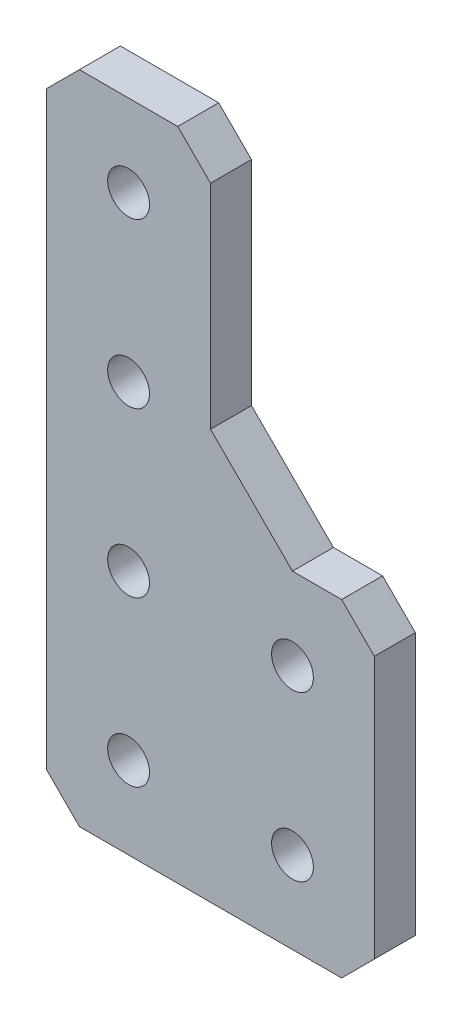
ISO-10303-21;
HEADER;
FILE_DESCRIPTION(('STEP AP214'),'2;1');
FILE_NAME('part.step','',(''),(''),'','','');
FILE_SCHEMA(('AUTOMOTIVE_DESIGN { 1 0 10303 214 1 1 1 1 }'));
ENDSEC;
DATA;
#1=APPLICATION_CONTEXT('core data for automotive mechanical design processes');
#2=APPLICATION_PROTOCOL_DEFINITION('international standard','automotive_design',2000,#1);
#3=PRODUCT_CONTEXT('',#1,'mechanical');
#4=PRODUCT('Part','Part','',(#3));
#5=PRODUCT_RELATED_PRODUCT_CATEGORY('part','',(#4));
#6=PRODUCT_DEFINITION_FORMATION('','',#4);
#7=PRODUCT_DEFINITION_CONTEXT('part definition',#1,'design');
#8=PRODUCT_DEFINITION('design','',#6,#7);
#9=PRODUCT_DEFINITION_SHAPE('','',#8);
#10=(LENGTH_UNIT() NAMED_UNIT(*) SI_UNIT(.MILLI.,.METRE.));
#11=(NAMED_UNIT(*) PLANE_ANGLE_UNIT() SI_UNIT($,.RADIAN.));
#12=(NAMED_UNIT(*) SI_UNIT($,.STERADIAN.) SOLID_ANGLE_UNIT());
#13=UNCERTAINTY_MEASURE_WITH_UNIT(LENGTH_MEASURE(1.E-05),#10,'distance_accuracy_value','');
#14=(GEOMETRIC_REPRESENTATION_CONTEXT(3) GLOBAL_UNCERTAINTY_ASSIGNED_CONTEXT((#13)) GLOBAL_UNIT_ASSIGNED_CONTEXT((#10,
#11,#12)) REPRESENTATION_CONTEXT('',''));
#15=CARTESIAN_POINT('',(0.,0.,0.));
#16=DIRECTION('',(0.,0.,1.));
#17=DIRECTION('',(1.,0.,0.));
#18=AXIS2_PLACEMENT_3D('',#15,#16,#17);
#19=CARTESIAN_POINT('',(40.,0.,5.));
#20=DIRECTION('',(0.,1.,0.));
#21=DIRECTION('',(-1.,0.,0.));
#22=AXIS2_PLACEMENT_3D('',#19,#20,#21);
#23=PLANE('',#22);
#24=DIRECTION('',(1.,0.,0.));
#25=VECTOR('',#24,1.);
#26=CARTESIAN_POINT('',(40.,0.,5.));
#27=LINE('',#26,#25);
#28=CARTESIAN_POINT('',(4.,0.,5.));
#29=VERTEX_POINT('',#28);
#30=CARTESIAN_POINT('',(36.,0.,5.));
#31=VERTEX_POINT('',#30);
#32=EDGE_CURVE('E176',#29,#31,#27,.T.);
#33=ORIENTED_EDGE('',*,*,#32,.F.);
#34=DIRECTION('',(0.,0.,-1.));
#35=VECTOR('',#34,1.);
#36=CARTESIAN_POINT('',(4.,0.,5.));
#37=LINE('',#36,#35);
#38=CARTESIAN_POINT('',(4.,0.,0.));
#39=VERTEX_POINT('',#38);
#40=EDGE_CURVE('E231',#29,#39,#37,.T.);
#41=ORIENTED_EDGE('',*,*,#40,.T.);
#42=DIRECTION('',(1.,0.,0.));
#43=VECTOR('',#42,1.);
#44=CARTESIAN_POINT('',(40.,0.,0.));
#45=LINE('',#44,#43);
#46=CARTESIAN_POINT('',(36.,0.,0.));
#47=VERTEX_POINT('',#46);
#48=EDGE_CURVE('E195',#39,#47,#45,.T.);
#49=ORIENTED_EDGE('',*,*,#48,.T.);
#50=DIRECTION('',(0.,0.,1.));
#51=VECTOR('',#50,1.);
#52=CARTESIAN_POINT('',(36.,0.,5.));
#53=LINE('',#52,#51);
#54=EDGE_CURVE('E229',#47,#31,#53,.T.);
#55=ORIENTED_EDGE('',*,*,#54,.T.);
#56=EDGE_LOOP('',(#33,#41,#49,#55));
#57=FACE_BOUND('',#56,.T.);
#58=ADVANCED_FACE('F45',(#57),#23,.F.);
#59=CARTESIAN_POINT('',(40.,0.,5.));
#60=DIRECTION('',(-1.,0.,0.));
#61=DIRECTION('',(0.,0.,1.));
#62=AXIS2_PLACEMENT_3D('',#59,#60,#61);
#63=PLANE('',#62);
#64=DIRECTION('',(0.,1.,0.));
#65=VECTOR('',#64,1.);
#66=CARTESIAN_POINT('',(40.,0.,5.));
#67=LINE('',#66,#65);
#68=CARTESIAN_POINT('',(40.,4.,5.));
#69=VERTEX_POINT('',#68);
#70=CARTESIAN_POINT('',(40.,36.,5.));
#71=VERTEX_POINT('',#70);
#72=EDGE_CURVE('E238',#69,#71,#67,.T.);
#73=ORIENTED_EDGE('',*,*,#72,.F.);
#74=DIRECTION('',(0.,0.,-1.));
#75=VECTOR('',#74,1.);
#76=CARTESIAN_POINT('',(40.,4.,5.));
#77=LINE('',#76,#75);
#78=CARTESIAN_POINT('',(40.,4.,0.));
#79=VERTEX_POINT('',#78);
#80=EDGE_CURVE('E54',#69,#79,#77,.T.);
#81=ORIENTED_EDGE('',*,*,#80,.T.);
#82=DIRECTION('',(0.,1.,0.));
#83=VECTOR('',#82,1.);
#84=CARTESIAN_POINT('',(40.,0.,0.));
#85=LINE('',#84,#83);
#86=CARTESIAN_POINT('',(40.,36.,0.));
#87=VERTEX_POINT('',#86);
#88=EDGE_CURVE('E170',#79,#87,#85,.T.);
#89=ORIENTED_EDGE('',*,*,#88,.T.);
#90=DIRECTION('',(0.,0.,1.));
#91=VECTOR('',#90,1.);
#92=CARTESIAN_POINT('',(40.,36.,5.));
#93=LINE('',#92,#91);
#94=EDGE_CURVE('E69',#87,#71,#93,.T.);
#95=ORIENTED_EDGE('',*,*,#94,.T.);
#96=EDGE_LOOP('',(#73,#81,#89,#95));
#97=FACE_BOUND('',#96,.T.);
#98=ADVANCED_FACE('F237',(#97),#63,.F.);
#99=CARTESIAN_POINT('',(40.,40.,5.));
#100=DIRECTION('',(0.,-1.,0.));
#101=DIRECTION('',(1.,0.,0.));
#102=AXIS2_PLACEMENT_3D('',#99,#100,#101);
#103=PLANE('',#102);
#104=DIRECTION('',(-1.,0.,0.));
#105=VECTOR('',#104,1.);
#106=CARTESIAN_POINT('',(40.,40.,5.));
#107=LINE('',#106,#105);
#108=CARTESIAN_POINT('',(36.,40.,5.));
#109=VERTEX_POINT('',#108);
#110=CARTESIAN_POINT('',(30.,40.,5.));
#111=VERTEX_POINT('',#110);
#112=EDGE_CURVE('E251',#109,#111,#107,.T.);
#113=ORIENTED_EDGE('',*,*,#112,.F.);
#114=DIRECTION('',(0.,0.,-1.));
#115=VECTOR('',#114,1.);
#116=CARTESIAN_POINT('',(36.,40.,5.));
#117=LINE('',#116,#115);
#118=CARTESIAN_POINT('',(36.,40.,0.));
#119=VERTEX_POINT('',#118);
#120=EDGE_CURVE('E11',#109,#119,#117,.T.);
#121=ORIENTED_EDGE('',*,*,#120,.T.);
#122=DIRECTION('',(-1.,0.,0.));
#123=VECTOR('',#122,1.);
#124=CARTESIAN_POINT('',(40.,40.,0.));
#125=LINE('',#124,#123);
#126=CARTESIAN_POINT('',(30.,40.,0.));
#127=VERTEX_POINT('',#126);
#128=EDGE_CURVE('E165',#119,#127,#125,.T.);
#129=ORIENTED_EDGE('',*,*,#128,.T.);
#130=DIRECTION('',(0.,0.,1.));
#131=VECTOR('',#130,1.);
#132=CARTESIAN_POINT('',(30.,40.,5.));
#133=LINE('',#132,#131);
#134=EDGE_CURVE('E144',#127,#111,#133,.T.);
#135=ORIENTED_EDGE('',*,*,#134,.T.);
#136=EDGE_LOOP('',(#113,#121,#129,#135));
#137=FACE_BOUND('',#136,.T.);
#138=ADVANCED_FACE('F323',(#137),#103,.F.);
#139=CARTESIAN_POINT('',(20.,80.,5.));
#140=DIRECTION('',(-1.,0.,0.));
#141=DIRECTION('',(0.,0.,1.));
#142=AXIS2_PLACEMENT_3D('',#139,#140,#141);
#143=PLANE('',#142);
#144=DIRECTION('',(0.,1.,0.));
#145=VECTOR('',#144,1.);
#146=CARTESIAN_POINT('',(20.,80.,0.));
#147=LINE('',#146,#145);
#148=CARTESIAN_POINT('',(20.,50.0000000000001,0.));
#149=VERTEX_POINT('',#148);
#150=CARTESIAN_POINT('',(20.,76.,0.));
#151=VERTEX_POINT('',#150);
#152=EDGE_CURVE('E154',#149,#151,#147,.T.);
#153=ORIENTED_EDGE('',*,*,#152,.T.);
#154=DIRECTION('',(0.,0.,1.));
#155=VECTOR('',#154,1.);
#156=CARTESIAN_POINT('',(20.,76.,5.));
#157=LINE('',#156,#155);
#158=CARTESIAN_POINT('',(20.,76.,5.));
#159=VERTEX_POINT('',#158);
#160=EDGE_CURVE('E203',#151,#159,#157,.T.);
#161=ORIENTED_EDGE('',*,*,#160,.T.);
#162=DIRECTION('',(0.,1.,0.));
#163=VECTOR('',#162,1.);
#164=CARTESIAN_POINT('',(20.,80.,5.));
#165=LINE('',#164,#163);
#166=CARTESIAN_POINT('',(20.,50.0000000000001,5.));
#167=VERTEX_POINT('',#166);
#168=EDGE_CURVE('E157',#167,#159,#165,.T.);
#169=ORIENTED_EDGE('',*,*,#168,.F.);
#170=DIRECTION('',(0.,0.,-1.));
#171=VECTOR('',#170,1.);
#172=CARTESIAN_POINT('',(20.,50.0000000000001,0.));
#173=LINE('',#172,#171);
#174=EDGE_CURVE('E142',#167,#149,#173,.T.);
#175=ORIENTED_EDGE('',*,*,#174,.T.);
#176=EDGE_LOOP('',(#153,#161,#169,#175));
#177=FACE_BOUND('',#176,.T.);
#178=ADVANCED_FACE('F153',(#177),#143,.F.);
#179=CARTESIAN_POINT('',(0.,80.,5.));
#180=DIRECTION('',(0.,-1.,0.));
#181=DIRECTION('',(0.,0.,-1.));
#182=AXIS2_PLACEMENT_3D('',#179,#180,#181);
#183=PLANE('',#182);
#184=DIRECTION('',(-1.,0.,0.));
#185=VECTOR('',#184,1.);
#186=CARTESIAN_POINT('',(0.,80.,0.));
#187=LINE('',#186,#185);
#188=CARTESIAN_POINT('',(16.,80.,0.));
#189=VERTEX_POINT('',#188);
#190=CARTESIAN_POINT('',(4.,80.,0.));
#191=VERTEX_POINT('',#190);
#192=EDGE_CURVE('E164',#189,#191,#187,.T.);
#193=ORIENTED_EDGE('',*,*,#192,.T.);
#194=DIRECTION('',(0.,0.,1.));
#195=VECTOR('',#194,1.);
#196=CARTESIAN_POINT('',(4.,80.,5.));
#197=LINE('',#196,#195);
#198=CARTESIAN_POINT('',(4.,80.,5.));
#199=VERTEX_POINT('',#198);
#200=EDGE_CURVE('E220',#191,#199,#197,.T.);
#201=ORIENTED_EDGE('',*,*,#200,.T.);
#202=DIRECTION('',(-1.,0.,0.));
#203=VECTOR('',#202,1.);
#204=CARTESIAN_POINT('',(0.,80.,5.));
#205=LINE('',#204,#203);
#206=CARTESIAN_POINT('',(16.,80.,5.));
#207=VERTEX_POINT('',#206);
#208=EDGE_CURVE('E247',#207,#199,#205,.T.);
#209=ORIENTED_EDGE('',*,*,#208,.F.);
#210=DIRECTION('',(0.,0.,-1.));
#211=VECTOR('',#210,1.);
#212=CARTESIAN_POINT('',(16.,80.,5.));
#213=LINE('',#212,#211);
#214=EDGE_CURVE('E199',#207,#189,#213,.T.);
#215=ORIENTED_EDGE('',*,*,#214,.T.);
#216=EDGE_LOOP('',(#193,#201,#209,#215));
#217=FACE_BOUND('',#216,.T.);
#218=ADVANCED_FACE('F464',(#217),#183,.F.);
#219=CARTESIAN_POINT('',(0.,0.,5.));
#220=DIRECTION('',(1.,0.,0.));
#221=DIRECTION('',(0.,0.,-1.));
#222=AXIS2_PLACEMENT_3D('',#219,#220,#221);
#223=PLANE('',#222);
#224=DIRECTION('',(0.,-1.,0.));
#225=VECTOR('',#224,1.);
#226=CARTESIAN_POINT('',(0.,0.,5.));
#227=LINE('',#226,#225);
#228=CARTESIAN_POINT('',(0.,76.,5.));
#229=VERTEX_POINT('',#228);
#230=CARTESIAN_POINT('',(0.,4.00000000000002,5.));
#231=VERTEX_POINT('',#230);
#232=EDGE_CURVE('E158',#229,#231,#227,.T.);
#233=ORIENTED_EDGE('',*,*,#232,.F.);
#234=DIRECTION('',(0.,0.,-1.));
#235=VECTOR('',#234,1.);
#236=CARTESIAN_POINT('',(0.,76.,5.));
#237=LINE('',#236,#235);
#238=CARTESIAN_POINT('',(0.,76.,0.));
#239=VERTEX_POINT('',#238);
#240=EDGE_CURVE('E209',#229,#239,#237,.T.);
#241=ORIENTED_EDGE('',*,*,#240,.T.);
#242=DIRECTION('',(0.,-1.,0.));
#243=VECTOR('',#242,1.);
#244=CARTESIAN_POINT('',(0.,0.,0.));
#245=LINE('',#244,#243);
#246=CARTESIAN_POINT('',(0.,4.00000000000002,0.));
#247=VERTEX_POINT('',#246);
#248=EDGE_CURVE('E168',#239,#247,#245,.T.);
#249=ORIENTED_EDGE('',*,*,#248,.T.);
#250=DIRECTION('',(0.,0.,1.));
#251=VECTOR('',#250,1.);
#252=CARTESIAN_POINT('',(0.,4.00000000000002,5.));
#253=LINE('',#252,#251);
#254=EDGE_CURVE('E207',#247,#231,#253,.T.);
#255=ORIENTED_EDGE('',*,*,#254,.T.);
#256=EDGE_LOOP('',(#233,#241,#249,#255));
#257=FACE_BOUND('',#256,.T.);
#258=ADVANCED_FACE('F279',(#257),#223,.F.);
#259=CARTESIAN_POINT('',(0.,0.,5.));
#260=DIRECTION('',(0.,0.,-1.));
#261=DIRECTION('',(-1.,0.,0.));
#262=AXIS2_PLACEMENT_3D('',#259,#260,#261);
#263=PLANE('',#262);
#264=CARTESIAN_POINT('',(10.,70.,5.));
#265=DIRECTION('',(0.,0.,1.));
#266=DIRECTION('',(1.,0.,0.));
#267=AXIS2_PLACEMENT_3D('',#264,#265,#266);
#268=CIRCLE('',#267,2.55);
#269=CARTESIAN_POINT('',(12.55,70.,5.));
#270=VERTEX_POINT('',#269);
#271=EDGE_CURVE('E181',#270,#270,#268,.T.);
#272=ORIENTED_EDGE('',*,*,#271,.F.);
#273=EDGE_LOOP('',(#272));
#274=FACE_BOUND('',#273,.T.);
#275=CARTESIAN_POINT('',(30.,30.,5.));
#276=DIRECTION('',(0.,0.,1.));
#277=DIRECTION('',(1.,0.,0.));
#278=AXIS2_PLACEMENT_3D('',#275,#276,#277);
#279=CIRCLE('',#278,2.55);
#280=CARTESIAN_POINT('',(32.55,30.,5.));
#281=VERTEX_POINT('',#280);
#282=EDGE_CURVE('E260',#281,#281,#279,.T.);
#283=ORIENTED_EDGE('',*,*,#282,.F.);
#284=EDGE_LOOP('',(#283));
#285=FACE_BOUND('',#284,.T.);
#286=CARTESIAN_POINT('',(30.,10.,5.));
#287=DIRECTION('',(0.,0.,1.));
#288=DIRECTION('',(1.,0.,0.));
#289=AXIS2_PLACEMENT_3D('',#286,#287,#288);
#290=CIRCLE('',#289,2.55);
#291=CARTESIAN_POINT('',(32.55,10.,5.));
#292=VERTEX_POINT('',#291);
#293=EDGE_CURVE('E256',#292,#292,#290,.T.);
#294=ORIENTED_EDGE('',*,*,#293,.F.);
#295=EDGE_LOOP('',(#294));
#296=FACE_BOUND('',#295,.T.);
#297=CARTESIAN_POINT('',(10.,10.,5.));
#298=DIRECTION('',(0.,0.,1.));
#299=DIRECTION('',(1.,0.,0.));
#300=AXIS2_PLACEMENT_3D('',#297,#298,#299);
#301=CIRCLE('',#300,2.55);
#302=CARTESIAN_POINT('',(12.55,10.,5.));
#303=VERTEX_POINT('',#302);
#304=EDGE_CURVE('E259',#303,#303,#301,.T.);
#305=ORIENTED_EDGE('',*,*,#304,.F.);
#306=EDGE_LOOP('',(#305));
#307=FACE_BOUND('',#306,.T.);
#308=CARTESIAN_POINT('',(10.,30.,5.));
#309=DIRECTION('',(0.,0.,1.));
#310=DIRECTION('',(1.,0.,0.));
#311=AXIS2_PLACEMENT_3D('',#308,#309,#310);
#312=CIRCLE('',#311,2.55);
#313=CARTESIAN_POINT('',(12.55,30.,5.));
#314=VERTEX_POINT('',#313);
#315=EDGE_CURVE('E263',#314,#314,#312,.T.);
#316=ORIENTED_EDGE('',*,*,#315,.F.);
#317=EDGE_LOOP('',(#316));
#318=FACE_BOUND('',#317,.T.);
#319=CARTESIAN_POINT('',(10.,50.,5.));
#320=DIRECTION('',(0.,0.,1.));
#321=DIRECTION('',(1.,0.,0.));
#322=AXIS2_PLACEMENT_3D('',#319,#320,#321);
#323=CIRCLE('',#322,2.55);
#324=CARTESIAN_POINT('',(12.55,50.,5.));
#325=VERTEX_POINT('',#324);
#326=EDGE_CURVE('E266',#325,#325,#323,.T.);
#327=ORIENTED_EDGE('',*,*,#326,.F.);
#328=EDGE_LOOP('',(#327));
#329=FACE_BOUND('',#328,.T.);
#330=ORIENTED_EDGE('',*,*,#208,.T.);
#331=DIRECTION('',(0.707106781186549,0.707106781186546,0.));
#332=VECTOR('',#331,1.);
#333=CARTESIAN_POINT('',(0.,76.,5.));
#334=LINE('',#333,#332);
#335=EDGE_CURVE('E227',#199,#229,#334,.F.);
#336=ORIENTED_EDGE('',*,*,#335,.T.);
#337=ORIENTED_EDGE('',*,*,#232,.T.);
#338=DIRECTION('',(-0.707106781186546,0.707106781186549,0.));
#339=VECTOR('',#338,1.);
#340=CARTESIAN_POINT('',(4.,0.,5.));
#341=LINE('',#340,#339);
#342=EDGE_CURVE('E225',#231,#29,#341,.F.);
#343=ORIENTED_EDGE('',*,*,#342,.T.);
#344=ORIENTED_EDGE('',*,*,#32,.T.);
#345=DIRECTION('',(-0.707106781186549,-0.707106781186546,0.));
#346=VECTOR('',#345,1.);
#347=CARTESIAN_POINT('',(40.,4.,5.));
#348=LINE('',#347,#346);
#349=EDGE_CURVE('E223',#31,#69,#348,.F.);
#350=ORIENTED_EDGE('',*,*,#349,.T.);
#351=ORIENTED_EDGE('',*,*,#72,.T.);
#352=DIRECTION('',(0.707106781186546,-0.707106781186549,0.));
#353=VECTOR('',#352,1.);
#354=CARTESIAN_POINT('',(36.,40.,5.));
#355=LINE('',#354,#353);
#356=EDGE_CURVE('E61',#71,#109,#355,.F.);
#357=ORIENTED_EDGE('',*,*,#356,.T.);
#358=ORIENTED_EDGE('',*,*,#112,.T.);
#359=DIRECTION('',(0.707106781186544,-0.707106781186551,0.));
#360=VECTOR('',#359,1.);
#361=CARTESIAN_POINT('',(35.0000000000001,34.9999999999998,5.));
#362=LINE('',#361,#360);
#363=EDGE_CURVE('E148',#111,#167,#362,.F.);
#364=ORIENTED_EDGE('',*,*,#363,.T.);
#365=ORIENTED_EDGE('',*,*,#168,.T.);
#366=DIRECTION('',(0.707106781186546,-0.707106781186549,0.));
#367=VECTOR('',#366,1.);
#368=CARTESIAN_POINT('',(16.,80.,5.));
#369=LINE('',#368,#367);
#370=EDGE_CURVE('E205',#159,#207,#369,.F.);
#371=ORIENTED_EDGE('',*,*,#370,.T.);
#372=EDGE_LOOP('',(#330,#336,#337,#343,#344,#350,#351,#357,#358,#364,#365,#371));
#373=FACE_BOUND('',#372,.T.);
#374=ADVANCED_FACE('F276',(#274,#285,#296,#307,#318,#329,#373),#263,.F.);
#375=CARTESIAN_POINT('',(0.,0.,0.));
#376=DIRECTION('',(0.,0.,-1.));
#377=DIRECTION('',(-1.,0.,0.));
#378=AXIS2_PLACEMENT_3D('',#375,#376,#377);
#379=PLANE('',#378);
#380=CARTESIAN_POINT('',(10.,70.,0.));
#381=DIRECTION('',(0.,0.,-1.));
#382=DIRECTION('',(-1.,0.,0.));
#383=AXIS2_PLACEMENT_3D('',#380,#381,#382);
#384=CIRCLE('',#383,2.55);
#385=CARTESIAN_POINT('',(7.45,70.,0.));
#386=VERTEX_POINT('',#385);
#387=EDGE_CURVE('E193',#386,#386,#384,.T.);
#388=ORIENTED_EDGE('',*,*,#387,.F.);
#389=EDGE_LOOP('',(#388));
#390=FACE_BOUND('',#389,.T.);
#391=CARTESIAN_POINT('',(30.,30.,0.));
#392=DIRECTION('',(0.,0.,-1.));
#393=DIRECTION('',(-1.,0.,0.));
#394=AXIS2_PLACEMENT_3D('',#391,#392,#393);
#395=CIRCLE('',#394,2.55);
#396=CARTESIAN_POINT('',(27.45,30.,0.));
#397=VERTEX_POINT('',#396);
#398=EDGE_CURVE('E190',#397,#397,#395,.T.);
#399=ORIENTED_EDGE('',*,*,#398,.F.);
#400=EDGE_LOOP('',(#399));
#401=FACE_BOUND('',#400,.T.);
#402=CARTESIAN_POINT('',(30.,10.,0.));
#403=DIRECTION('',(0.,0.,-1.));
#404=DIRECTION('',(-1.,0.,0.));
#405=AXIS2_PLACEMENT_3D('',#402,#403,#404);
#406=CIRCLE('',#405,2.55);
#407=CARTESIAN_POINT('',(27.45,10.,0.));
#408=VERTEX_POINT('',#407);
#409=EDGE_CURVE('E187',#408,#408,#406,.T.);
#410=ORIENTED_EDGE('',*,*,#409,.F.);
#411=EDGE_LOOP('',(#410));
#412=FACE_BOUND('',#411,.T.);
#413=CARTESIAN_POINT('',(10.,10.,0.));
#414=DIRECTION('',(0.,0.,-1.));
#415=DIRECTION('',(-1.,0.,0.));
#416=AXIS2_PLACEMENT_3D('',#413,#414,#415);
#417=CIRCLE('',#416,2.55);
#418=CARTESIAN_POINT('',(7.45000000000001,10.,0.));
#419=VERTEX_POINT('',#418);
#420=EDGE_CURVE('E184',#419,#419,#417,.T.);
#421=ORIENTED_EDGE('',*,*,#420,.F.);
#422=EDGE_LOOP('',(#421));
#423=FACE_BOUND('',#422,.T.);
#424=CARTESIAN_POINT('',(10.,30.,0.));
#425=DIRECTION('',(0.,0.,-1.));
#426=DIRECTION('',(-1.,0.,0.));
#427=AXIS2_PLACEMENT_3D('',#424,#425,#426);
#428=CIRCLE('',#427,2.55);
#429=CARTESIAN_POINT('',(7.45,30.,0.));
#430=VERTEX_POINT('',#429);
#431=EDGE_CURVE('E180',#430,#430,#428,.T.);
#432=ORIENTED_EDGE('',*,*,#431,.F.);
#433=EDGE_LOOP('',(#432));
#434=FACE_BOUND('',#433,.T.);
#435=CARTESIAN_POINT('',(10.,50.,0.));
#436=DIRECTION('',(0.,0.,-1.));
#437=DIRECTION('',(-1.,0.,0.));
#438=AXIS2_PLACEMENT_3D('',#435,#436,#437);
#439=CIRCLE('',#438,2.55);
#440=CARTESIAN_POINT('',(7.45,50.,0.));
#441=VERTEX_POINT('',#440);
#442=EDGE_CURVE('E177',#441,#441,#439,.T.);
#443=ORIENTED_EDGE('',*,*,#442,.F.);
#444=EDGE_LOOP('',(#443));
#445=FACE_BOUND('',#444,.T.);
#446=ORIENTED_EDGE('',*,*,#248,.F.);
#447=DIRECTION('',(-0.707106781186549,-0.707106781186546,0.));
#448=VECTOR('',#447,1.);
#449=CARTESIAN_POINT('',(-38.,38.0000000000001,0.));
#450=LINE('',#449,#448);
#451=EDGE_CURVE('E218',#239,#191,#450,.F.);
#452=ORIENTED_EDGE('',*,*,#451,.T.);
#453=ORIENTED_EDGE('',*,*,#192,.F.);
#454=DIRECTION('',(-0.707106781186546,0.707106781186549,0.));
#455=VECTOR('',#454,1.);
#456=CARTESIAN_POINT('',(48.,47.9999999999999,0.));
#457=LINE('',#456,#455);
#458=EDGE_CURVE('E163',#189,#151,#457,.F.);
#459=ORIENTED_EDGE('',*,*,#458,.T.);
#460=ORIENTED_EDGE('',*,*,#152,.F.);
#461=DIRECTION('',(-0.707106781186544,0.707106781186551,0.));
#462=VECTOR('',#461,1.);
#463=CARTESIAN_POINT('',(20.,50.0000000000001,0.));
#464=LINE('',#463,#462);
#465=EDGE_CURVE('E138',#149,#127,#464,.F.);
#466=ORIENTED_EDGE('',*,*,#465,.T.);
#467=ORIENTED_EDGE('',*,*,#128,.F.);
#468=DIRECTION('',(-0.707106781186546,0.707106781186549,0.));
#469=VECTOR('',#468,1.);
#470=CARTESIAN_POINT('',(38.0000000000001,37.9999999999999,0.));
#471=LINE('',#470,#469);
#472=EDGE_CURVE('E212',#119,#87,#471,.F.);
#473=ORIENTED_EDGE('',*,*,#472,.T.);
#474=ORIENTED_EDGE('',*,*,#88,.F.);
#475=DIRECTION('',(0.707106781186549,0.707106781186546,0.));
#476=VECTOR('',#475,1.);
#477=CARTESIAN_POINT('',(17.9999999999999,-18.,0.));
#478=LINE('',#477,#476);
#479=EDGE_CURVE('E214',#79,#47,#478,.F.);
#480=ORIENTED_EDGE('',*,*,#479,.T.);
#481=ORIENTED_EDGE('',*,*,#48,.F.);
#482=DIRECTION('',(0.707106781186546,-0.707106781186549,0.));
#483=VECTOR('',#482,1.);
#484=CARTESIAN_POINT('',(2.00000000000001,2.,0.));
#485=LINE('',#484,#483);
#486=EDGE_CURVE('E216',#39,#247,#485,.F.);
#487=ORIENTED_EDGE('',*,*,#486,.T.);
#488=EDGE_LOOP('',(#446,#452,#453,#459,#460,#466,#467,#473,#474,#480,#481,#487));
#489=FACE_BOUND('',#488,.T.);
#490=ADVANCED_FACE('F161',(#390,#401,#412,#423,#434,#445,#489),#379,.T.);
#491=CARTESIAN_POINT('',(10.,50.,-5.));
#492=DIRECTION('',(0.,0.,1.));
#493=DIRECTION('',(1.,0.,0.));
#494=AXIS2_PLACEMENT_3D('',#491,#492,#493);
#495=CYLINDRICAL_SURFACE('',#494,2.55);
#496=ORIENTED_EDGE('',*,*,#442,.T.);
#497=EDGE_LOOP('',(#496));
#498=FACE_BOUND('',#497,.T.);
#499=ORIENTED_EDGE('',*,*,#326,.T.);
#500=EDGE_LOOP('',(#499));
#501=FACE_BOUND('',#500,.T.);
#502=ADVANCED_FACE('F435',(#498,#501),#495,.F.);
#503=CARTESIAN_POINT('',(10.,30.,-5.));
#504=DIRECTION('',(0.,0.,1.));
#505=DIRECTION('',(1.,0.,0.));
#506=AXIS2_PLACEMENT_3D('',#503,#504,#505);
#507=CYLINDRICAL_SURFACE('',#506,2.55);
#508=ORIENTED_EDGE('',*,*,#431,.T.);
#509=EDGE_LOOP('',(#508));
#510=FACE_BOUND('',#509,.T.);
#511=ORIENTED_EDGE('',*,*,#315,.T.);
#512=EDGE_LOOP('',(#511));
#513=FACE_BOUND('',#512,.T.);
#514=ADVANCED_FACE('F426',(#510,#513),#507,.F.);
#515=CARTESIAN_POINT('',(10.,10.,-5.));
#516=DIRECTION('',(0.,0.,1.));
#517=DIRECTION('',(1.,0.,0.));
#518=AXIS2_PLACEMENT_3D('',#515,#516,#517);
#519=CYLINDRICAL_SURFACE('',#518,2.55);
#520=ORIENTED_EDGE('',*,*,#420,.T.);
#521=EDGE_LOOP('',(#520));
#522=FACE_BOUND('',#521,.T.);
#523=ORIENTED_EDGE('',*,*,#304,.T.);
#524=EDGE_LOOP('',(#523));
#525=FACE_BOUND('',#524,.T.);
#526=ADVANCED_FACE('F417',(#522,#525),#519,.F.);
#527=CARTESIAN_POINT('',(30.,10.,-5.));
#528=DIRECTION('',(0.,0.,1.));
#529=DIRECTION('',(1.,0.,0.));
#530=AXIS2_PLACEMENT_3D('',#527,#528,#529);
#531=CYLINDRICAL_SURFACE('',#530,2.55);
#532=ORIENTED_EDGE('',*,*,#409,.T.);
#533=EDGE_LOOP('',(#532));
#534=FACE_BOUND('',#533,.T.);
#535=ORIENTED_EDGE('',*,*,#293,.T.);
#536=EDGE_LOOP('',(#535));
#537=FACE_BOUND('',#536,.T.);
#538=ADVANCED_FACE('F408',(#534,#537),#531,.F.);
#539=CARTESIAN_POINT('',(30.,30.,-5.));
#540=DIRECTION('',(0.,0.,1.));
#541=DIRECTION('',(1.,0.,0.));
#542=AXIS2_PLACEMENT_3D('',#539,#540,#541);
#543=CYLINDRICAL_SURFACE('',#542,2.55);
#544=ORIENTED_EDGE('',*,*,#398,.T.);
#545=EDGE_LOOP('',(#544));
#546=FACE_BOUND('',#545,.T.);
#547=ORIENTED_EDGE('',*,*,#282,.T.);
#548=EDGE_LOOP('',(#547));
#549=FACE_BOUND('',#548,.T.);
#550=ADVANCED_FACE('F399',(#546,#549),#543,.F.);
#551=CARTESIAN_POINT('',(10.,70.,-5.));
#552=DIRECTION('',(0.,0.,1.));
#553=DIRECTION('',(1.,0.,0.));
#554=AXIS2_PLACEMENT_3D('',#551,#552,#553);
#555=CYLINDRICAL_SURFACE('',#554,2.55);
#556=ORIENTED_EDGE('',*,*,#387,.T.);
#557=EDGE_LOOP('',(#556));
#558=FACE_BOUND('',#557,.T.);
#559=ORIENTED_EDGE('',*,*,#271,.T.);
#560=EDGE_LOOP('',(#559));
#561=FACE_BOUND('',#560,.T.);
#562=ADVANCED_FACE('F274',(#558,#561),#555,.F.);
#563=CARTESIAN_POINT('',(20.,50.0000000000001,5.));
#564=DIRECTION('',(0.707106781186551,0.707106781186544,0.));
#565=DIRECTION('',(0.,0.,1.));
#566=AXIS2_PLACEMENT_3D('',#563,#564,#565);
#567=PLANE('',#566);
#568=ORIENTED_EDGE('',*,*,#363,.F.);
#569=ORIENTED_EDGE('',*,*,#134,.F.);
#570=ORIENTED_EDGE('',*,*,#465,.F.);
#571=ORIENTED_EDGE('',*,*,#174,.F.);
#572=EDGE_LOOP('',(#568,#569,#570,#571));
#573=FACE_BOUND('',#572,.T.);
#574=ADVANCED_FACE('F141',(#573),#567,.T.);
#575=CARTESIAN_POINT('',(16.,80.,5.));
#576=DIRECTION('',(-0.707106781186549,-0.707106781186546,0.));
#577=DIRECTION('',(0.,0.,-1.));
#578=AXIS2_PLACEMENT_3D('',#575,#576,#577);
#579=PLANE('',#578);
#580=ORIENTED_EDGE('',*,*,#370,.F.);
#581=ORIENTED_EDGE('',*,*,#160,.F.);
#582=ORIENTED_EDGE('',*,*,#458,.F.);
#583=ORIENTED_EDGE('',*,*,#214,.F.);
#584=EDGE_LOOP('',(#580,#581,#582,#583));
#585=FACE_BOUND('',#584,.T.);
#586=ADVANCED_FACE('F333',(#585),#579,.F.);
#587=CARTESIAN_POINT('',(0.,76.,5.));
#588=DIRECTION('',(0.707106781186546,-0.707106781186549,0.));
#589=DIRECTION('',(0.,0.,-1.));
#590=AXIS2_PLACEMENT_3D('',#587,#588,#589);
#591=PLANE('',#590);
#592=ORIENTED_EDGE('',*,*,#335,.F.);
#593=ORIENTED_EDGE('',*,*,#200,.F.);
#594=ORIENTED_EDGE('',*,*,#451,.F.);
#595=ORIENTED_EDGE('',*,*,#240,.F.);
#596=EDGE_LOOP('',(#592,#593,#594,#595));
#597=FACE_BOUND('',#596,.T.);
#598=ADVANCED_FACE('F299',(#597),#591,.F.);
#599=CARTESIAN_POINT('',(4.,0.,5.));
#600=DIRECTION('',(0.707106781186549,0.707106781186546,0.));
#601=DIRECTION('',(0.,0.,-1.));
#602=AXIS2_PLACEMENT_3D('',#599,#600,#601);
#603=PLANE('',#602);
#604=ORIENTED_EDGE('',*,*,#342,.F.);
#605=ORIENTED_EDGE('',*,*,#254,.F.);
#606=ORIENTED_EDGE('',*,*,#486,.F.);
#607=ORIENTED_EDGE('',*,*,#40,.F.);
#608=EDGE_LOOP('',(#604,#605,#606,#607));
#609=FACE_BOUND('',#608,.T.);
#610=ADVANCED_FACE('F305',(#609),#603,.F.);
#611=CARTESIAN_POINT('',(40.,4.,5.));
#612=DIRECTION('',(-0.707106781186546,0.707106781186549,0.));
#613=DIRECTION('',(0.,0.,-1.));
#614=AXIS2_PLACEMENT_3D('',#611,#612,#613);
#615=PLANE('',#614);
#616=ORIENTED_EDGE('',*,*,#349,.F.);
#617=ORIENTED_EDGE('',*,*,#54,.F.);
#618=ORIENTED_EDGE('',*,*,#479,.F.);
#619=ORIENTED_EDGE('',*,*,#80,.F.);
#620=EDGE_LOOP('',(#616,#617,#618,#619));
#621=FACE_BOUND('',#620,.T.);
#622=ADVANCED_FACE('F309',(#621),#615,.F.);
#623=CARTESIAN_POINT('',(36.,40.,5.));
#624=DIRECTION('',(-0.707106781186549,-0.707106781186546,0.));
#625=DIRECTION('',(0.,0.,-1.));
#626=AXIS2_PLACEMENT_3D('',#623,#624,#625);
#627=PLANE('',#626);
#628=ORIENTED_EDGE('',*,*,#356,.F.);
#629=ORIENTED_EDGE('',*,*,#94,.F.);
#630=ORIENTED_EDGE('',*,*,#472,.F.);
#631=ORIENTED_EDGE('',*,*,#120,.F.);
#632=EDGE_LOOP('',(#628,#629,#630,#631));
#633=FACE_BOUND('',#632,.T.);
#634=ADVANCED_FACE('F48',(#633),#627,.F.);
#635=CLOSED_SHELL('',(#58,#98,#138,#178,#218,#258,#374,#490,#502,#514,#526,#538,#550,#562,#574,
#586,#598,#610,#622,#634));
#636=MANIFOLD_SOLID_BREP('B2',#635);
#637=ADVANCED_BREP_SHAPE_REPRESENTATION('',(#18,#636),#14);
#638=SHAPE_DEFINITION_REPRESENTATION(#9,#637);
ENDSEC;
END-ISO-10303-21;
